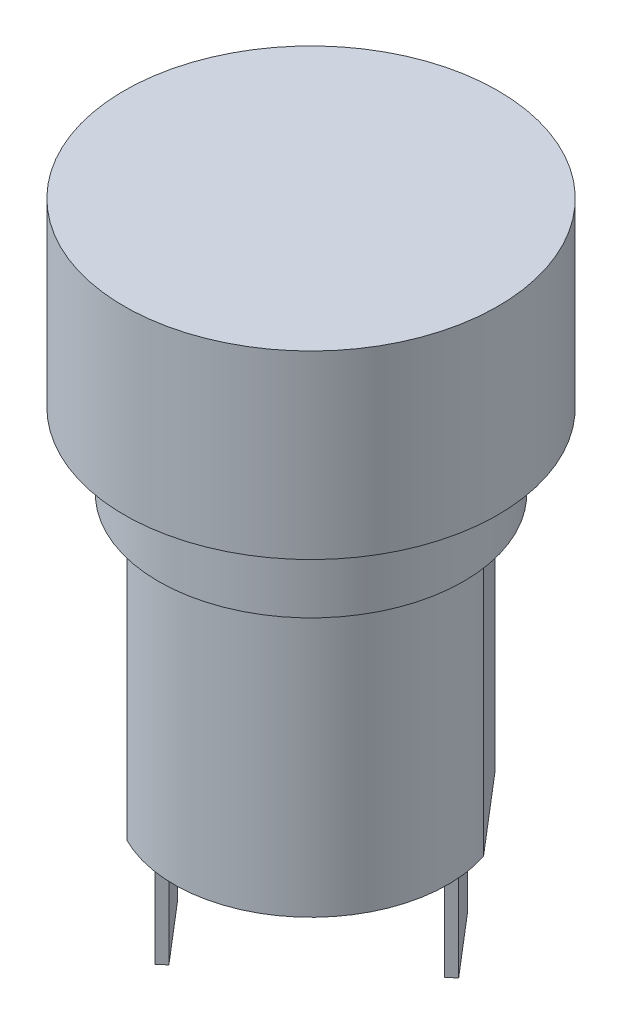
ISO-10303-21;
HEADER;
FILE_DESCRIPTION(('STEP AP214'),'2;1');
FILE_NAME('part.step','',(''),(''),'','','');
FILE_SCHEMA(('AUTOMOTIVE_DESIGN { 1 0 10303 214 1 1 1 1 }'));
ENDSEC;
DATA;
#1=APPLICATION_CONTEXT('core data for automotive mechanical design processes');
#2=APPLICATION_PROTOCOL_DEFINITION('international standard','automotive_design',2000,#1);
#3=PRODUCT_CONTEXT('',#1,'mechanical');
#4=PRODUCT('Part','Part','',(#3));
#5=PRODUCT_RELATED_PRODUCT_CATEGORY('part','',(#4));
#6=PRODUCT_DEFINITION_FORMATION('','',#4);
#7=PRODUCT_DEFINITION_CONTEXT('part definition',#1,'design');
#8=PRODUCT_DEFINITION('design','',#6,#7);
#9=PRODUCT_DEFINITION_SHAPE('','',#8);
#10=(LENGTH_UNIT() NAMED_UNIT(*) SI_UNIT(.MILLI.,.METRE.));
#11=(NAMED_UNIT(*) PLANE_ANGLE_UNIT() SI_UNIT($,.RADIAN.));
#12=(NAMED_UNIT(*) SI_UNIT($,.STERADIAN.) SOLID_ANGLE_UNIT());
#13=UNCERTAINTY_MEASURE_WITH_UNIT(LENGTH_MEASURE(1.E-05),#10,'distance_accuracy_value','');
#14=(GEOMETRIC_REPRESENTATION_CONTEXT(3) GLOBAL_UNCERTAINTY_ASSIGNED_CONTEXT((#13)) GLOBAL_UNIT_ASSIGNED_CONTEXT((#10,
#11,#12)) REPRESENTATION_CONTEXT('',''));
#15=CARTESIAN_POINT('',(0.,0.,0.));
#16=DIRECTION('',(0.,0.,1.));
#17=DIRECTION('',(1.,0.,0.));
#18=AXIS2_PLACEMENT_3D('',#15,#16,#17);
#19=CARTESIAN_POINT('',(0.,0.,0.));
#20=DIRECTION('',(0.,1.,0.));
#21=DIRECTION('',(0.,0.,1.));
#22=AXIS2_PLACEMENT_3D('',#19,#20,#21);
#23=PLANE('',#22);
#24=CARTESIAN_POINT('',(0.,0.,0.));
#25=DIRECTION('',(0.,1.,0.));
#26=DIRECTION('',(0.,0.,1.));
#27=AXIS2_PLACEMENT_3D('',#24,#25,#26);
#28=CIRCLE('',#27,11.);
#29=CARTESIAN_POINT('',(4.95855558106647,0.,-9.81899824572113));
#30=VERTEX_POINT('',#29);
#31=CARTESIAN_POINT('',(-10.4697423624442,0.,3.37409170948899));
#32=VERTEX_POINT('',#31);
#33=EDGE_CURVE('E212',#30,#32,#28,.T.);
#34=ORIENTED_EDGE('',*,*,#33,.F.);
#35=DIRECTION('',(-0.649905909123651,0.,-0.760014677020228));
#36=VECTOR('',#35,1.);
#37=CARTESIAN_POINT('',(10.4697423624442,0.,-3.37409170948899));
#38=LINE('',#37,#36);
#39=CARTESIAN_POINT('',(10.4697423624442,0.,-3.37409170948899));
#40=VERTEX_POINT('',#39);
#41=EDGE_CURVE('E183',#40,#30,#38,.T.);
#42=ORIENTED_EDGE('',*,*,#41,.F.);
#43=CARTESIAN_POINT('',(-4.95855558106647,0.,9.81899824572113));
#44=VERTEX_POINT('',#43);
#45=EDGE_CURVE('E38',#44,#40,#28,.T.);
#46=ORIENTED_EDGE('',*,*,#45,.F.);
#47=DIRECTION('',(0.649905909123651,0.,0.760014677020228));
#48=VECTOR('',#47,1.);
#49=CARTESIAN_POINT('',(-4.95855558106647,0.,9.81899824572113));
#50=LINE('',#49,#48);
#51=EDGE_CURVE('E182',#32,#44,#50,.T.);
#52=ORIENTED_EDGE('',*,*,#51,.F.);
#53=EDGE_LOOP('',(#34,#42,#46,#52));
#54=FACE_BOUND('',#53,.T.);
#55=DIRECTION('',(-0.649905909123652,0.,-0.760014677020227));
#56=VECTOR('',#55,1.);
#57=CARTESIAN_POINT('',(5.96611521460879,0.,-5.10176138662067));
#58=LINE('',#57,#56);
#59=CARTESIAN_POINT('',(8.01332649234373,0.,-2.70770619155725));
#60=VERTEX_POINT('',#59);
#61=CARTESIAN_POINT('',(3.91891926486473,0.,-7.49579865678468));
#62=VERTEX_POINT('',#61);
#63=EDGE_CURVE('E148',#60,#62,#58,.T.);
#64=ORIENTED_EDGE('',*,*,#63,.F.);
#65=DIRECTION('',(0.760014677020227,0.,-0.649905909123651));
#66=VECTOR('',#65,1.);
#67=CARTESIAN_POINT('',(2.04721127773494,0.,2.39405519506342));
#68=LINE('',#67,#66);
#69=CARTESIAN_POINT('',(8.62133823395991,0.,-3.22763091885617));
#70=VERTEX_POINT('',#69);
#71=EDGE_CURVE('E145',#60,#70,#68,.T.);
#72=ORIENTED_EDGE('',*,*,#71,.T.);
#73=DIRECTION('',(-0.649905909123651,0.,-0.760014677020228));
#74=VECTOR('',#73,1.);
#75=CARTESIAN_POINT('',(6.57412695622497,0.,-5.62168611391958));
#76=LINE('',#75,#74);
#77=CARTESIAN_POINT('',(4.52693100648091,0.,-8.0157233840836));
#78=VERTEX_POINT('',#77);
#79=EDGE_CURVE('E158',#70,#78,#76,.T.);
#80=ORIENTED_EDGE('',*,*,#79,.T.);
#81=DIRECTION('',(-0.760014677020227,0.,0.649905909123651));
#82=VECTOR('',#81,1.);
#83=CARTESIAN_POINT('',(-2.04719594974406,0.,-2.39403727016401));
#84=LINE('',#83,#82);
#85=EDGE_CURVE('E169',#78,#62,#84,.T.);
#86=ORIENTED_EDGE('',*,*,#85,.T.);
#87=EDGE_LOOP('',(#64,#72,#80,#86));
#88=FACE_BOUND('',#87,.T.);
#89=DIRECTION('',(-0.760014677020228,0.,0.64990590912365));
#90=VECTOR('',#89,1.);
#91=CARTESIAN_POINT('',(2.04721127773494,0.,2.39405519506342));
#92=LINE('',#91,#90);
#93=CARTESIAN_POINT('',(-3.91890393687385,0.,7.49581658168408));
#94=VERTEX_POINT('',#93);
#95=CARTESIAN_POINT('',(-4.52691567849003,0.,8.015741308983));
#96=VERTEX_POINT('',#95);
#97=EDGE_CURVE('E144',#94,#96,#92,.T.);
#98=ORIENTED_EDGE('',*,*,#97,.F.);
#99=DIRECTION('',(0.64990590912365,0.,0.760014677020228));
#100=VECTOR('',#99,1.);
#101=CARTESIAN_POINT('',(-5.9661152146088,0.,5.10176138662066));
#102=LINE('',#101,#100);
#103=CARTESIAN_POINT('',(-8.01331116435285,0.,2.70772411645665));
#104=VERTEX_POINT('',#103);
#105=EDGE_CURVE('E141',#104,#94,#102,.T.);
#106=ORIENTED_EDGE('',*,*,#105,.F.);
#107=DIRECTION('',(0.760014677020228,0.,-0.64990590912365));
#108=VECTOR('',#107,1.);
#109=CARTESIAN_POINT('',(-2.04719594974405,0.,-2.39403727016401));
#110=LINE('',#109,#108);
#111=CARTESIAN_POINT('',(-8.62132290596903,0.,3.22764884375557));
#112=VERTEX_POINT('',#111);
#113=EDGE_CURVE('E55',#112,#104,#110,.T.);
#114=ORIENTED_EDGE('',*,*,#113,.F.);
#115=DIRECTION('',(-0.649905909123651,0.,-0.760014677020228));
#116=VECTOR('',#115,1.);
#117=CARTESIAN_POINT('',(-6.57412695622497,0.,5.62168611391958));
#118=LINE('',#117,#116);
#119=EDGE_CURVE('E50',#96,#112,#118,.T.);
#120=ORIENTED_EDGE('',*,*,#119,.F.);
#121=EDGE_LOOP('',(#98,#106,#114,#120));
#122=FACE_BOUND('',#121,.T.);
#123=ADVANCED_FACE('F34',(#54,#88,#122),#23,.F.);
#124=CARTESIAN_POINT('',(0.,21.7,0.));
#125=DIRECTION('',(0.,-1.,0.));
#126=DIRECTION('',(0.,0.,-1.));
#127=AXIS2_PLACEMENT_3D('',#124,#125,#126);
#128=CYLINDRICAL_SURFACE('',#127,11.);
#129=CARTESIAN_POINT('',(0.,21.7,0.));
#130=DIRECTION('',(0.,1.,0.));
#131=DIRECTION('',(0.,0.,1.));
#132=AXIS2_PLACEMENT_3D('',#129,#130,#131);
#133=CIRCLE('',#132,11.);
#134=CARTESIAN_POINT('',(4.95855558106647,21.7,-9.81899824572113));
#135=VERTEX_POINT('',#134);
#136=CARTESIAN_POINT('',(-10.4697423624442,21.7,3.37409170948899));
#137=VERTEX_POINT('',#136);
#138=EDGE_CURVE('E11',#135,#137,#133,.T.);
#139=ORIENTED_EDGE('',*,*,#138,.F.);
#140=DIRECTION('',(0.,-1.,0.));
#141=VECTOR('',#140,1.);
#142=CARTESIAN_POINT('',(4.95855558106647,30.1799764150615,-9.81899824572113));
#143=LINE('',#142,#141);
#144=EDGE_CURVE('E188',#135,#30,#143,.T.);
#145=ORIENTED_EDGE('',*,*,#144,.T.);
#146=ORIENTED_EDGE('',*,*,#33,.T.);
#147=DIRECTION('',(0.,-1.,0.));
#148=VECTOR('',#147,1.);
#149=CARTESIAN_POINT('',(-10.4697423624442,30.1799764150615,3.37409170948899));
#150=LINE('',#149,#148);
#151=EDGE_CURVE('E186',#137,#32,#150,.T.);
#152=ORIENTED_EDGE('',*,*,#151,.F.);
#153=EDGE_LOOP('',(#139,#145,#146,#152));
#154=FACE_BOUND('',#153,.T.);
#155=ADVANCED_FACE('F232',(#154),#128,.T.);
#156=ORIENTED_EDGE('',*,*,#45,.T.);
#157=DIRECTION('',(0.,-1.,0.));
#158=VECTOR('',#157,1.);
#159=CARTESIAN_POINT('',(10.4697423624442,30.1799764150615,-3.37409170948899));
#160=LINE('',#159,#158);
#161=CARTESIAN_POINT('',(10.4697423624442,21.7,-3.37409170948899));
#162=VERTEX_POINT('',#161);
#163=EDGE_CURVE('E191',#162,#40,#160,.T.);
#164=ORIENTED_EDGE('',*,*,#163,.F.);
#165=CARTESIAN_POINT('',(-4.95855558106647,21.7,9.81899824572113));
#166=VERTEX_POINT('',#165);
#167=EDGE_CURVE('E43',#166,#162,#133,.T.);
#168=ORIENTED_EDGE('',*,*,#167,.F.);
#169=DIRECTION('',(0.,-1.,0.));
#170=VECTOR('',#169,1.);
#171=CARTESIAN_POINT('',(-4.95855558106647,30.1799764150615,9.81899824572113));
#172=LINE('',#171,#170);
#173=EDGE_CURVE('E197',#166,#44,#172,.T.);
#174=ORIENTED_EDGE('',*,*,#173,.T.);
#175=EDGE_LOOP('',(#156,#164,#168,#174));
#176=FACE_BOUND('',#175,.T.);
#177=ADVANCED_FACE('F36',(#176),#128,.T.);
#178=CARTESIAN_POINT('',(0.,27.7,0.));
#179=DIRECTION('',(0.,-1.,0.));
#180=DIRECTION('',(0.,0.,-1.));
#181=AXIS2_PLACEMENT_3D('',#178,#179,#180);
#182=CYLINDRICAL_SURFACE('',#181,12.25);
#183=CARTESIAN_POINT('',(0.,27.7,0.));
#184=DIRECTION('',(0.,1.,0.));
#185=DIRECTION('',(0.,0.,1.));
#186=AXIS2_PLACEMENT_3D('',#183,#184,#185);
#187=CIRCLE('',#186,12.25);
#188=CARTESIAN_POINT('',(0.,27.7,12.25));
#189=VERTEX_POINT('',#188);
#190=EDGE_CURVE('E207',#189,#189,#187,.T.);
#191=ORIENTED_EDGE('',*,*,#190,.F.);
#192=EDGE_LOOP('',(#191));
#193=FACE_BOUND('',#192,.T.);
#194=CARTESIAN_POINT('',(0.,21.7,0.));
#195=DIRECTION('',(0.,1.,0.));
#196=DIRECTION('',(0.,0.,1.));
#197=AXIS2_PLACEMENT_3D('',#194,#195,#196);
#198=CIRCLE('',#197,12.25);
#199=CARTESIAN_POINT('',(0.,21.7,12.25));
#200=VERTEX_POINT('',#199);
#201=EDGE_CURVE('E204',#200,#200,#198,.T.);
#202=ORIENTED_EDGE('',*,*,#201,.T.);
#203=EDGE_LOOP('',(#202));
#204=FACE_BOUND('',#203,.T.);
#205=ADVANCED_FACE('F255',(#193,#204),#182,.T.);
#206=CARTESIAN_POINT('',(0.,21.7,0.));
#207=DIRECTION('',(0.,1.,0.));
#208=DIRECTION('',(0.,0.,1.));
#209=AXIS2_PLACEMENT_3D('',#206,#207,#208);
#210=PLANE('',#209);
#211=ORIENTED_EDGE('',*,*,#167,.T.);
#212=DIRECTION('',(-0.649905909123651,0.,-0.760014677020228));
#213=VECTOR('',#212,1.);
#214=CARTESIAN_POINT('',(10.4697423624442,21.7,-3.37409170948899));
#215=LINE('',#214,#213);
#216=EDGE_CURVE('E185',#162,#135,#215,.T.);
#217=ORIENTED_EDGE('',*,*,#216,.T.);
#218=ORIENTED_EDGE('',*,*,#138,.T.);
#219=DIRECTION('',(0.649905909123651,0.,0.760014677020228));
#220=VECTOR('',#219,1.);
#221=CARTESIAN_POINT('',(-4.95855558106647,21.7,9.81899824572113));
#222=LINE('',#221,#220);
#223=EDGE_CURVE('E195',#137,#166,#222,.T.);
#224=ORIENTED_EDGE('',*,*,#223,.T.);
#225=EDGE_LOOP('',(#211,#217,#218,#224));
#226=FACE_BOUND('',#225,.T.);
#227=ORIENTED_EDGE('',*,*,#201,.F.);
#228=EDGE_LOOP('',(#227));
#229=FACE_BOUND('',#228,.T.);
#230=ADVANCED_FACE('F233',(#226,#229),#210,.F.);
#231=CARTESIAN_POINT('',(0.,42.2,0.));
#232=DIRECTION('',(0.,-1.,0.));
#233=DIRECTION('',(0.,0.,-1.));
#234=AXIS2_PLACEMENT_3D('',#231,#232,#233);
#235=CYLINDRICAL_SURFACE('',#234,15.);
#236=CARTESIAN_POINT('',(0.,42.2,0.));
#237=DIRECTION('',(0.,1.,0.));
#238=DIRECTION('',(0.,0.,1.));
#239=AXIS2_PLACEMENT_3D('',#236,#237,#238);
#240=CIRCLE('',#239,15.);
#241=CARTESIAN_POINT('',(0.,42.2,-15.));
#242=VERTEX_POINT('',#241);
#243=EDGE_CURVE('E201',#242,#242,#240,.T.);
#244=CARTESIAN_POINT('',(0.,27.7,0.));
#245=DIRECTION('',(0.,1.,0.));
#246=DIRECTION('',(0.,0.,1.));
#247=AXIS2_PLACEMENT_3D('',#244,#245,#246);
#248=CIRCLE('',#247,15.);
#249=CARTESIAN_POINT('',(0.,27.7,-15.));
#250=VERTEX_POINT('',#249);
#251=EDGE_CURVE('E193',#250,#250,#248,.T.);
#252=CARTESIAN_POINT('',(0.,42.2,-15.));
#253=CARTESIAN_POINT('',(0.,42.0489583333333,-15.));
#254=CARTESIAN_POINT('',(0.,41.8979166666667,-15.));
#255=CARTESIAN_POINT('',(0.,41.5958333333333,-15.));
#256=CARTESIAN_POINT('',(0.,41.4447916666667,-15.));
#257=CARTESIAN_POINT('',(0.,41.1427083333333,-15.));
#258=CARTESIAN_POINT('',(0.,40.9916666666667,-15.));
#259=CARTESIAN_POINT('',(0.,40.6895833333333,-15.));
#260=CARTESIAN_POINT('',(0.,40.5385416666667,-15.));
#261=CARTESIAN_POINT('',(0.,40.2364583333333,-15.));
#262=CARTESIAN_POINT('',(0.,40.0854166666667,-15.));
#263=CARTESIAN_POINT('',(0.,39.7833333333333,-15.));
#264=CARTESIAN_POINT('',(0.,39.6322916666667,-15.));
#265=CARTESIAN_POINT('',(0.,39.3302083333333,-15.));
#266=CARTESIAN_POINT('',(0.,39.1791666666667,-15.));
#267=CARTESIAN_POINT('',(0.,38.8770833333333,-15.));
#268=CARTESIAN_POINT('',(0.,38.7260416666667,-15.));
#269=CARTESIAN_POINT('',(0.,38.4239583333333,-15.));
#270=CARTESIAN_POINT('',(0.,38.2729166666667,-15.));
#271=CARTESIAN_POINT('',(0.,37.9708333333333,-15.));
#272=CARTESIAN_POINT('',(0.,37.8197916666667,-15.));
#273=CARTESIAN_POINT('',(0.,37.5177083333333,-15.));
#274=CARTESIAN_POINT('',(0.,37.3666666666667,-15.));
#275=CARTESIAN_POINT('',(0.,37.0645833333333,-15.));
#276=CARTESIAN_POINT('',(0.,36.9135416666667,-15.));
#277=CARTESIAN_POINT('',(0.,36.6114583333333,-15.));
#278=CARTESIAN_POINT('',(0.,36.4604166666667,-15.));
#279=CARTESIAN_POINT('',(0.,36.1583333333333,-15.));
#280=CARTESIAN_POINT('',(0.,36.0072916666667,-15.));
#281=CARTESIAN_POINT('',(0.,35.7052083333333,-15.));
#282=CARTESIAN_POINT('',(0.,35.5541666666667,-15.));
#283=CARTESIAN_POINT('',(0.,35.2520833333333,-15.));
#284=CARTESIAN_POINT('',(0.,35.1010416666667,-15.));
#285=CARTESIAN_POINT('',(0.,34.7989583333333,-15.));
#286=CARTESIAN_POINT('',(0.,34.6479166666667,-15.));
#287=CARTESIAN_POINT('',(0.,34.3458333333333,-15.));
#288=CARTESIAN_POINT('',(0.,34.1947916666667,-15.));
#289=CARTESIAN_POINT('',(0.,33.8927083333333,-15.));
#290=CARTESIAN_POINT('',(0.,33.7416666666667,-15.));
#291=CARTESIAN_POINT('',(0.,33.4395833333333,-15.));
#292=CARTESIAN_POINT('',(0.,33.2885416666667,-15.));
#293=CARTESIAN_POINT('',(0.,32.9864583333333,-15.));
#294=CARTESIAN_POINT('',(0.,32.8354166666667,-15.));
#295=CARTESIAN_POINT('',(0.,32.5333333333333,-15.));
#296=CARTESIAN_POINT('',(0.,32.3822916666667,-15.));
#297=CARTESIAN_POINT('',(0.,32.0802083333333,-15.));
#298=CARTESIAN_POINT('',(0.,31.9291666666667,-15.));
#299=CARTESIAN_POINT('',(0.,31.6270833333333,-15.));
#300=CARTESIAN_POINT('',(0.,31.4760416666667,-15.));
#301=CARTESIAN_POINT('',(0.,31.1739583333333,-15.));
#302=CARTESIAN_POINT('',(0.,31.0229166666667,-15.));
#303=CARTESIAN_POINT('',(0.,30.7208333333333,-15.));
#304=CARTESIAN_POINT('',(0.,30.5697916666667,-15.));
#305=CARTESIAN_POINT('',(0.,30.2677083333333,-15.));
#306=CARTESIAN_POINT('',(0.,30.1166666666667,-15.));
#307=CARTESIAN_POINT('',(0.,29.8145833333333,-15.));
#308=CARTESIAN_POINT('',(0.,29.6635416666667,-15.));
#309=CARTESIAN_POINT('',(0.,29.3614583333333,-15.));
#310=CARTESIAN_POINT('',(0.,29.2104166666667,-15.));
#311=CARTESIAN_POINT('',(0.,28.9083333333333,-15.));
#312=CARTESIAN_POINT('',(0.,28.7572916666667,-15.));
#313=CARTESIAN_POINT('',(0.,28.4552083333333,-15.));
#314=CARTESIAN_POINT('',(0.,28.3041666666667,-15.));
#315=CARTESIAN_POINT('',(0.,28.0020833333333,-15.));
#316=CARTESIAN_POINT('',(0.,27.8510416666667,-15.));
#317=CARTESIAN_POINT('',(0.,27.7,-15.));
#318=B_SPLINE_CURVE_WITH_KNOTS('',3,(#252,#253,#254,#255,#256,#257,#258,#259,#260,#261,#262,
#263,#264,#265,#266,#267,#268,#269,#270,#271,#272,#273,#274,#275,#276,#277,#278,#279,#280,#281,
#282,#283,#284,#285,#286,#287,#288,#289,#290,#291,#292,#293,#294,#295,#296,#297,#298,#299,#300,
#301,#302,#303,#304,#305,#306,#307,#308,#309,#310,#311,#312,#313,#314,#315,#316,#317),
.UNSPECIFIED.,.F.,.F.,(4,2,2,2,2,2,2,2,2,2,2,2,2,2,2,2,2,2,2,2,2,2,2,2,2,2,2,2,2,2,2,2,4),(0.,
0.453124999999999,0.906249999999997,1.359375,1.81249999999999,2.26562499999999,2.71875,3.171875,
3.625,4.07812499999999,4.53124999999999,4.98437499999999,5.4375,5.890625,6.34375,
6.79687499999999,7.24999999999999,7.703125,8.15625,8.60937499999999,9.06249999999999,
9.51562499999999,9.96874999999999,10.421875,10.875,11.328125,11.78125,12.234375,12.6875,
13.140625,13.59375,14.046875,14.5),.UNSPECIFIED.);
#319=EDGE_CURVE('BSEAM261',#242,#250,#318,.T.);
#320=ORIENTED_EDGE('',*,*,#243,.F.);
#321=ORIENTED_EDGE('',*,*,#251,.T.);
#322=ORIENTED_EDGE('',*,*,#319,.T.);
#323=ORIENTED_EDGE('',*,*,#319,.F.);
#324=EDGE_LOOP('',(#320,#322,#321,#323));
#325=FACE_BOUND('',#324,.T.);
#326=ADVANCED_FACE('F261',(#325),#235,.T.);
#327=CARTESIAN_POINT('',(0.,42.2,0.));
#328=DIRECTION('',(0.,1.,0.));
#329=DIRECTION('',(0.,0.,1.));
#330=AXIS2_PLACEMENT_3D('',#327,#328,#329);
#331=PLANE('',#330);
#332=ORIENTED_EDGE('',*,*,#243,.T.);
#333=EDGE_LOOP('',(#332));
#334=FACE_BOUND('',#333,.T.);
#335=ADVANCED_FACE('F246',(#334),#331,.T.);
#336=CARTESIAN_POINT('',(0.,27.7,0.));
#337=DIRECTION('',(0.,1.,0.));
#338=DIRECTION('',(0.,0.,1.));
#339=AXIS2_PLACEMENT_3D('',#336,#337,#338);
#340=PLANE('',#339);
#341=ORIENTED_EDGE('',*,*,#190,.T.);
#342=EDGE_LOOP('',(#341));
#343=FACE_BOUND('',#342,.T.);
#344=ORIENTED_EDGE('',*,*,#251,.F.);
#345=EDGE_LOOP('',(#344));
#346=FACE_BOUND('',#345,.T.);
#347=ADVANCED_FACE('F238',(#343,#346),#340,.F.);
#348=CARTESIAN_POINT('',(-4.95855558106647,30.1799764150615,9.81899824572113));
#349=DIRECTION('',(0.760014677020228,0.,-0.649905909123651));
#350=DIRECTION('',(-0.649905909123651,0.,-0.760014677020228));
#351=AXIS2_PLACEMENT_3D('',#348,#349,#350);
#352=PLANE('',#351);
#353=ORIENTED_EDGE('',*,*,#151,.T.);
#354=ORIENTED_EDGE('',*,*,#51,.T.);
#355=ORIENTED_EDGE('',*,*,#173,.F.);
#356=ORIENTED_EDGE('',*,*,#223,.F.);
#357=EDGE_LOOP('',(#353,#354,#355,#356));
#358=FACE_BOUND('',#357,.T.);
#359=ADVANCED_FACE('F236',(#358),#352,.F.);
#360=CARTESIAN_POINT('',(10.4697423624442,30.1799764150615,-3.37409170948899));
#361=DIRECTION('',(-0.760014677020228,0.,0.649905909123651));
#362=DIRECTION('',(0.649905909123651,0.,0.760014677020228));
#363=AXIS2_PLACEMENT_3D('',#360,#361,#362);
#364=PLANE('',#363);
#365=ORIENTED_EDGE('',*,*,#163,.T.);
#366=ORIENTED_EDGE('',*,*,#41,.T.);
#367=ORIENTED_EDGE('',*,*,#144,.F.);
#368=ORIENTED_EDGE('',*,*,#216,.F.);
#369=EDGE_LOOP('',(#365,#366,#367,#368));
#370=FACE_BOUND('',#369,.T.);
#371=ADVANCED_FACE('F230',(#370),#364,.F.);
#372=CARTESIAN_POINT('',(2.04721127773494,-9.3,2.39405519506342));
#373=DIRECTION('',(0.649905909123651,0.,0.760014677020227));
#374=DIRECTION('',(0.760014677020227,0.,-0.649905909123651));
#375=AXIS2_PLACEMENT_3D('',#372,#373,#374);
#376=PLANE('',#375);
#377=ORIENTED_EDGE('',*,*,#71,.F.);
#378=DIRECTION('',(0.,1.,0.));
#379=VECTOR('',#378,1.);
#380=CARTESIAN_POINT('',(8.01332649234373,-9.3,-2.70770619155725));
#381=LINE('',#380,#379);
#382=CARTESIAN_POINT('',(8.01332649234373,-9.3,-2.70770619155725));
#383=VERTEX_POINT('',#382);
#384=EDGE_CURVE('E180',#383,#60,#381,.T.);
#385=ORIENTED_EDGE('',*,*,#384,.F.);
#386=DIRECTION('',(0.760014677020227,0.,-0.649905909123651));
#387=VECTOR('',#386,1.);
#388=CARTESIAN_POINT('',(2.04721127773494,-9.3,2.39405519506342));
#389=LINE('',#388,#387);
#390=CARTESIAN_POINT('',(8.62133823395991,-9.3,-3.22763091885617));
#391=VERTEX_POINT('',#390);
#392=EDGE_CURVE('E154',#383,#391,#389,.T.);
#393=ORIENTED_EDGE('',*,*,#392,.T.);
#394=DIRECTION('',(0.,1.,0.));
#395=VECTOR('',#394,1.);
#396=CARTESIAN_POINT('',(8.62133823395991,-9.3,-3.22763091885617));
#397=LINE('',#396,#395);
#398=EDGE_CURVE('E165',#391,#70,#397,.T.);
#399=ORIENTED_EDGE('',*,*,#398,.T.);
#400=EDGE_LOOP('',(#377,#385,#393,#399));
#401=FACE_BOUND('',#400,.T.);
#402=ADVANCED_FACE('F244',(#401),#376,.T.);
#403=CARTESIAN_POINT('',(5.96611521460879,-9.3,-5.10176138662067));
#404=DIRECTION('',(0.760014677020227,0.,-0.649905909123651));
#405=DIRECTION('',(-0.649905909123651,0.,-0.760014677020227));
#406=AXIS2_PLACEMENT_3D('',#403,#404,#405);
#407=PLANE('',#406);
#408=ORIENTED_EDGE('',*,*,#63,.T.);
#409=DIRECTION('',(0.,1.,0.));
#410=VECTOR('',#409,1.);
#411=CARTESIAN_POINT('',(3.91891926486473,-9.3,-7.49579865678468));
#412=LINE('',#411,#410);
#413=CARTESIAN_POINT('',(3.91891926486473,-9.3,-7.49579865678468));
#414=VERTEX_POINT('',#413);
#415=EDGE_CURVE('E178',#414,#62,#412,.T.);
#416=ORIENTED_EDGE('',*,*,#415,.F.);
#417=DIRECTION('',(-0.649905909123652,0.,-0.760014677020227));
#418=VECTOR('',#417,1.);
#419=CARTESIAN_POINT('',(5.96611521460879,-9.3,-5.10176138662067));
#420=LINE('',#419,#418);
#421=EDGE_CURVE('E157',#383,#414,#420,.T.);
#422=ORIENTED_EDGE('',*,*,#421,.F.);
#423=ORIENTED_EDGE('',*,*,#384,.T.);
#424=EDGE_LOOP('',(#408,#416,#422,#423));
#425=FACE_BOUND('',#424,.T.);
#426=ADVANCED_FACE('F322',(#425),#407,.F.);
#427=CARTESIAN_POINT('',(-2.04719594974406,-9.3,-2.39403727016401));
#428=DIRECTION('',(-0.649905909123651,0.,-0.760014677020227));
#429=DIRECTION('',(-0.760014677020227,0.,0.649905909123651));
#430=AXIS2_PLACEMENT_3D('',#427,#428,#429);
#431=PLANE('',#430);
#432=ORIENTED_EDGE('',*,*,#85,.F.);
#433=DIRECTION('',(0.,1.,0.));
#434=VECTOR('',#433,1.);
#435=CARTESIAN_POINT('',(4.52693100648091,-9.3,-8.0157233840836));
#436=LINE('',#435,#434);
#437=CARTESIAN_POINT('',(4.52693100648091,-9.3,-8.0157233840836));
#438=VERTEX_POINT('',#437);
#439=EDGE_CURVE('E175',#438,#78,#436,.T.);
#440=ORIENTED_EDGE('',*,*,#439,.F.);
#441=DIRECTION('',(-0.760014677020227,0.,0.649905909123651));
#442=VECTOR('',#441,1.);
#443=CARTESIAN_POINT('',(-2.04719594974406,-9.3,-2.39403727016401));
#444=LINE('',#443,#442);
#445=EDGE_CURVE('E160',#438,#414,#444,.T.);
#446=ORIENTED_EDGE('',*,*,#445,.T.);
#447=ORIENTED_EDGE('',*,*,#415,.T.);
#448=EDGE_LOOP('',(#432,#440,#446,#447));
#449=FACE_BOUND('',#448,.T.);
#450=ADVANCED_FACE('F333',(#449),#431,.T.);
#451=CARTESIAN_POINT('',(6.57412695622497,-9.3,-5.62168611391958));
#452=DIRECTION('',(0.760014677020228,0.,-0.649905909123651));
#453=DIRECTION('',(-0.649905909123651,0.,-0.760014677020228));
#454=AXIS2_PLACEMENT_3D('',#451,#452,#453);
#455=PLANE('',#454);
#456=ORIENTED_EDGE('',*,*,#79,.F.);
#457=ORIENTED_EDGE('',*,*,#398,.F.);
#458=DIRECTION('',(-0.649905909123651,0.,-0.760014677020228));
#459=VECTOR('',#458,1.);
#460=CARTESIAN_POINT('',(6.57412695622497,-9.3,-5.62168611391958));
#461=LINE('',#460,#459);
#462=EDGE_CURVE('E163',#391,#438,#461,.T.);
#463=ORIENTED_EDGE('',*,*,#462,.T.);
#464=ORIENTED_EDGE('',*,*,#439,.T.);
#465=EDGE_LOOP('',(#456,#457,#463,#464));
#466=FACE_BOUND('',#465,.T.);
#467=ADVANCED_FACE('F343',(#466),#455,.T.);
#468=CARTESIAN_POINT('',(0.,-9.3,0.));
#469=DIRECTION('',(0.,-1.,0.));
#470=DIRECTION('',(0.,0.,-1.));
#471=AXIS2_PLACEMENT_3D('',#468,#469,#470);
#472=PLANE('',#471);
#473=ORIENTED_EDGE('',*,*,#392,.F.);
#474=ORIENTED_EDGE('',*,*,#421,.T.);
#475=ORIENTED_EDGE('',*,*,#445,.F.);
#476=ORIENTED_EDGE('',*,*,#462,.F.);
#477=EDGE_LOOP('',(#473,#474,#475,#476));
#478=FACE_BOUND('',#477,.T.);
#479=ADVANCED_FACE('F353',(#478),#472,.T.);
#480=CARTESIAN_POINT('',(2.04721127773494,-9.3,2.39405519506342));
#481=DIRECTION('',(-0.64990590912365,0.,-0.760014677020228));
#482=DIRECTION('',(-0.760014677020228,0.,0.64990590912365));
#483=AXIS2_PLACEMENT_3D('',#480,#481,#482);
#484=PLANE('',#483);
#485=ORIENTED_EDGE('',*,*,#97,.T.);
#486=DIRECTION('',(0.,1.,0.));
#487=VECTOR('',#486,1.);
#488=CARTESIAN_POINT('',(-4.52691567849003,-9.3,8.015741308983));
#489=LINE('',#488,#487);
#490=CARTESIAN_POINT('',(-4.52691567849003,-9.3,8.015741308983));
#491=VERTEX_POINT('',#490);
#492=EDGE_CURVE('E125',#491,#96,#489,.T.);
#493=ORIENTED_EDGE('',*,*,#492,.F.);
#494=DIRECTION('',(-0.760014677020228,0.,0.64990590912365));
#495=VECTOR('',#494,1.);
#496=CARTESIAN_POINT('',(2.04721127773494,-9.3,2.39405519506342));
#497=LINE('',#496,#495);
#498=CARTESIAN_POINT('',(-3.91890393687385,-9.3,7.49581658168408));
#499=VERTEX_POINT('',#498);
#500=EDGE_CURVE('E132',#499,#491,#497,.T.);
#501=ORIENTED_EDGE('',*,*,#500,.F.);
#502=DIRECTION('',(0.,1.,0.));
#503=VECTOR('',#502,1.);
#504=CARTESIAN_POINT('',(-3.91890393687385,-9.3,7.49581658168408));
#505=LINE('',#504,#503);
#506=EDGE_CURVE('E416',#499,#94,#505,.T.);
#507=ORIENTED_EDGE('',*,*,#506,.T.);
#508=EDGE_LOOP('',(#485,#493,#501,#507));
#509=FACE_BOUND('',#508,.T.);
#510=ADVANCED_FACE('F143',(#509),#484,.F.);
#511=CARTESIAN_POINT('',(-6.57412695622497,-9.3,5.62168611391958));
#512=DIRECTION('',(0.760014677020228,0.,-0.649905909123651));
#513=DIRECTION('',(-0.649905909123651,0.,-0.760014677020228));
#514=AXIS2_PLACEMENT_3D('',#511,#512,#513);
#515=PLANE('',#514);
#516=ORIENTED_EDGE('',*,*,#119,.T.);
#517=DIRECTION('',(0.,1.,0.));
#518=VECTOR('',#517,1.);
#519=CARTESIAN_POINT('',(-8.62132290596903,-9.3,3.22764884375557));
#520=LINE('',#519,#518);
#521=CARTESIAN_POINT('',(-8.62132290596903,-9.3,3.22764884375557));
#522=VERTEX_POINT('',#521);
#523=EDGE_CURVE('E128',#522,#112,#520,.T.);
#524=ORIENTED_EDGE('',*,*,#523,.F.);
#525=DIRECTION('',(-0.649905909123651,0.,-0.760014677020228));
#526=VECTOR('',#525,1.);
#527=CARTESIAN_POINT('',(-6.57412695622497,-9.3,5.62168611391958));
#528=LINE('',#527,#526);
#529=EDGE_CURVE('E121',#491,#522,#528,.T.);
#530=ORIENTED_EDGE('',*,*,#529,.F.);
#531=ORIENTED_EDGE('',*,*,#492,.T.);
#532=EDGE_LOOP('',(#516,#524,#530,#531));
#533=FACE_BOUND('',#532,.T.);
#534=ADVANCED_FACE('F123',(#533),#515,.F.);
#535=CARTESIAN_POINT('',(-2.04719594974405,-9.3,-2.39403727016401));
#536=DIRECTION('',(0.64990590912365,0.,0.760014677020228));
#537=DIRECTION('',(0.760014677020228,0.,-0.64990590912365));
#538=AXIS2_PLACEMENT_3D('',#535,#536,#537);
#539=PLANE('',#538);
#540=ORIENTED_EDGE('',*,*,#113,.T.);
#541=DIRECTION('',(0.,1.,0.));
#542=VECTOR('',#541,1.);
#543=CARTESIAN_POINT('',(-8.01331116435285,-9.3,2.70772411645665));
#544=LINE('',#543,#542);
#545=CARTESIAN_POINT('',(-8.01331116435285,-9.3,2.70772411645665));
#546=VERTEX_POINT('',#545);
#547=EDGE_CURVE('E150',#546,#104,#544,.T.);
#548=ORIENTED_EDGE('',*,*,#547,.F.);
#549=DIRECTION('',(0.760014677020228,0.,-0.64990590912365));
#550=VECTOR('',#549,1.);
#551=CARTESIAN_POINT('',(-2.04719594974405,-9.3,-2.39403727016401));
#552=LINE('',#551,#550);
#553=EDGE_CURVE('E131',#522,#546,#552,.T.);
#554=ORIENTED_EDGE('',*,*,#553,.F.);
#555=ORIENTED_EDGE('',*,*,#523,.T.);
#556=EDGE_LOOP('',(#540,#548,#554,#555));
#557=FACE_BOUND('',#556,.T.);
#558=ADVANCED_FACE('F380',(#557),#539,.F.);
#559=CARTESIAN_POINT('',(-5.9661152146088,-9.3,5.10176138662066));
#560=DIRECTION('',(-0.760014677020228,0.,0.64990590912365));
#561=DIRECTION('',(0.64990590912365,0.,0.760014677020228));
#562=AXIS2_PLACEMENT_3D('',#559,#560,#561);
#563=PLANE('',#562);
#564=ORIENTED_EDGE('',*,*,#105,.T.);
#565=ORIENTED_EDGE('',*,*,#506,.F.);
#566=DIRECTION('',(0.64990590912365,0.,0.760014677020228));
#567=VECTOR('',#566,1.);
#568=CARTESIAN_POINT('',(-5.9661152146088,-9.3,5.10176138662066));
#569=LINE('',#568,#567);
#570=EDGE_CURVE('E137',#546,#499,#569,.T.);
#571=ORIENTED_EDGE('',*,*,#570,.F.);
#572=ORIENTED_EDGE('',*,*,#547,.T.);
#573=EDGE_LOOP('',(#564,#565,#571,#572));
#574=FACE_BOUND('',#573,.T.);
#575=ADVANCED_FACE('F389',(#574),#563,.F.);
#576=CARTESIAN_POINT('',(0.,-9.3,0.));
#577=DIRECTION('',(0.,-1.,0.));
#578=DIRECTION('',(0.,0.,-1.));
#579=AXIS2_PLACEMENT_3D('',#576,#577,#578);
#580=PLANE('',#579);
#581=ORIENTED_EDGE('',*,*,#500,.T.);
#582=ORIENTED_EDGE('',*,*,#529,.T.);
#583=ORIENTED_EDGE('',*,*,#553,.T.);
#584=ORIENTED_EDGE('',*,*,#570,.T.);
#585=EDGE_LOOP('',(#581,#582,#583,#584));
#586=FACE_BOUND('',#585,.T.);
#587=ADVANCED_FACE('F135',(#586),#580,.T.);
#588=CLOSED_SHELL('',(#123,#155,#177,#205,#230,#326,#335,#347,#359,#371,#402,#426,#450,#467,
#479,#510,#534,#558,#575,#587));
#589=MANIFOLD_SOLID_BREP('B2',#588);
#590=ADVANCED_BREP_SHAPE_REPRESENTATION('',(#18,#589),#14);
#591=SHAPE_DEFINITION_REPRESENTATION(#9,#590);
ENDSEC;
END-ISO-10303-21;
